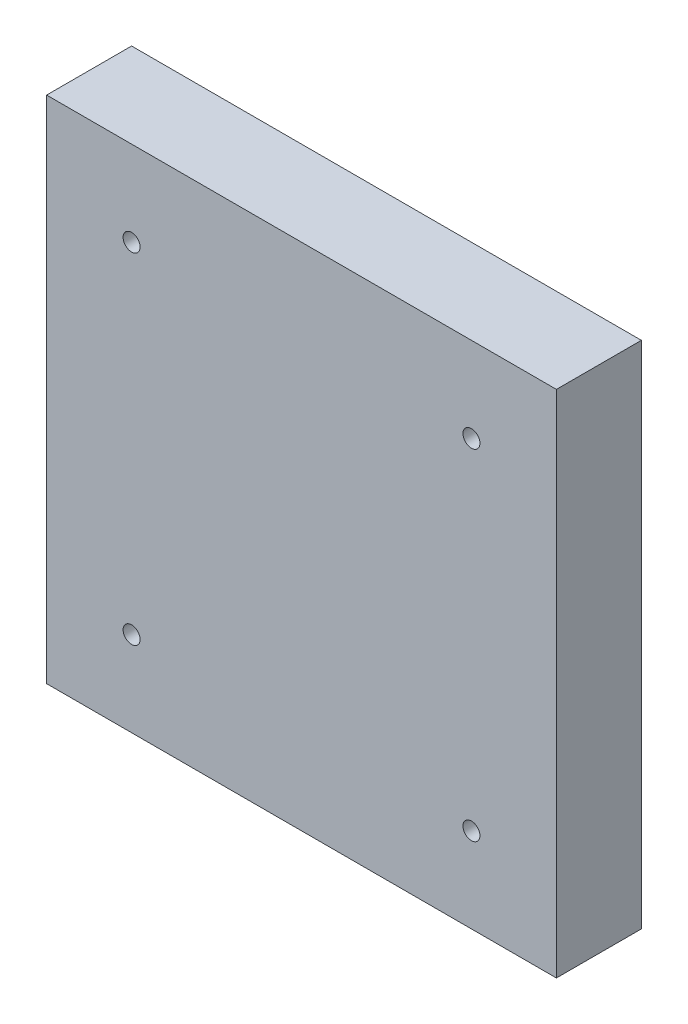
ISO-10303-21;
HEADER;
FILE_DESCRIPTION(('STEP AP214'),'2;1');
FILE_NAME('part.step','',(''),(''),'','','');
FILE_SCHEMA(('AUTOMOTIVE_DESIGN { 1 0 10303 214 1 1 1 1 }'));
ENDSEC;
DATA;
#1=APPLICATION_CONTEXT('core data for automotive mechanical design processes');
#2=APPLICATION_PROTOCOL_DEFINITION('international standard','automotive_design',2000,#1);
#3=PRODUCT_CONTEXT('',#1,'mechanical');
#4=PRODUCT('Part','Part','',(#3));
#5=PRODUCT_RELATED_PRODUCT_CATEGORY('part','',(#4));
#6=PRODUCT_DEFINITION_FORMATION('','',#4);
#7=PRODUCT_DEFINITION_CONTEXT('part definition',#1,'design');
#8=PRODUCT_DEFINITION('design','',#6,#7);
#9=PRODUCT_DEFINITION_SHAPE('','',#8);
#10=(LENGTH_UNIT() NAMED_UNIT(*) SI_UNIT(.MILLI.,.METRE.));
#11=(NAMED_UNIT(*) PLANE_ANGLE_UNIT() SI_UNIT($,.RADIAN.));
#12=(NAMED_UNIT(*) SI_UNIT($,.STERADIAN.) SOLID_ANGLE_UNIT());
#13=UNCERTAINTY_MEASURE_WITH_UNIT(LENGTH_MEASURE(1.E-05),#10,'distance_accuracy_value','');
#14=(GEOMETRIC_REPRESENTATION_CONTEXT(3) GLOBAL_UNCERTAINTY_ASSIGNED_CONTEXT((#13)) GLOBAL_UNIT_ASSIGNED_CONTEXT((#10,
#11,#12)) REPRESENTATION_CONTEXT('',''));
#15=CARTESIAN_POINT('',(0.,0.,0.));
#16=DIRECTION('',(0.,0.,1.));
#17=DIRECTION('',(1.,0.,0.));
#18=AXIS2_PLACEMENT_3D('',#15,#16,#17);
#19=CARTESIAN_POINT('',(0.,0.,12.7));
#20=DIRECTION('',(0.,0.,-1.));
#21=DIRECTION('',(-1.,0.,0.));
#22=AXIS2_PLACEMENT_3D('',#19,#20,#21);
#23=PLANE('',#22);
#24=CARTESIAN_POINT('',(63.5,63.5,12.7));
#25=DIRECTION('',(0.,0.,1.));
#26=DIRECTION('',(1.,0.,0.));
#27=AXIS2_PLACEMENT_3D('',#24,#25,#26);
#28=CIRCLE('',#27,1.26999999999999);
#29=CARTESIAN_POINT('',(64.77,63.5,12.7));
#30=VERTEX_POINT('',#29);
#31=EDGE_CURVE('E121',#30,#30,#28,.T.);
#32=ORIENTED_EDGE('',*,*,#31,.F.);
#33=EDGE_LOOP('',(#32));
#34=FACE_BOUND('',#33,.T.);
#35=CARTESIAN_POINT('',(12.7,12.7,12.7));
#36=DIRECTION('',(0.,0.,1.));
#37=DIRECTION('',(1.,0.,0.));
#38=AXIS2_PLACEMENT_3D('',#35,#36,#37);
#39=CIRCLE('',#38,1.27);
#40=CARTESIAN_POINT('',(13.97,12.7,12.7));
#41=VERTEX_POINT('',#40);
#42=EDGE_CURVE('E100',#41,#41,#39,.T.);
#43=ORIENTED_EDGE('',*,*,#42,.F.);
#44=EDGE_LOOP('',(#43));
#45=FACE_BOUND('',#44,.T.);
#46=DIRECTION('',(1.,0.,0.));
#47=VECTOR('',#46,1.);
#48=CARTESIAN_POINT('',(76.2,0.,12.7));
#49=LINE('',#48,#47);
#50=CARTESIAN_POINT('',(0.,0.,12.7));
#51=VERTEX_POINT('',#50);
#52=CARTESIAN_POINT('',(76.2,0.,12.7));
#53=VERTEX_POINT('',#52);
#54=EDGE_CURVE('E85',#51,#53,#49,.T.);
#55=ORIENTED_EDGE('',*,*,#54,.T.);
#56=DIRECTION('',(0.,1.,0.));
#57=VECTOR('',#56,1.);
#58=CARTESIAN_POINT('',(76.2,76.2,12.7));
#59=LINE('',#58,#57);
#60=CARTESIAN_POINT('',(76.2,76.2,12.7));
#61=VERTEX_POINT('',#60);
#62=EDGE_CURVE('E80',#53,#61,#59,.T.);
#63=ORIENTED_EDGE('',*,*,#62,.T.);
#64=DIRECTION('',(-1.,0.,0.));
#65=VECTOR('',#64,1.);
#66=CARTESIAN_POINT('',(0.,76.2,12.7));
#67=LINE('',#66,#65);
#68=CARTESIAN_POINT('',(0.,76.2,12.7));
#69=VERTEX_POINT('',#68);
#70=EDGE_CURVE('E83',#61,#69,#67,.T.);
#71=ORIENTED_EDGE('',*,*,#70,.T.);
#72=DIRECTION('',(0.,-1.,0.));
#73=VECTOR('',#72,1.);
#74=CARTESIAN_POINT('',(0.,0.,12.7));
#75=LINE('',#74,#73);
#76=EDGE_CURVE('E50',#69,#51,#75,.T.);
#77=ORIENTED_EDGE('',*,*,#76,.T.);
#78=EDGE_LOOP('',(#55,#63,#71,#77));
#79=FACE_BOUND('',#78,.T.);
#80=CARTESIAN_POINT('',(12.7,63.5,12.7));
#81=DIRECTION('',(0.,0.,1.));
#82=DIRECTION('',(1.,0.,0.));
#83=AXIS2_PLACEMENT_3D('',#80,#81,#82);
#84=CIRCLE('',#83,1.27);
#85=CARTESIAN_POINT('',(13.97,63.5,12.7));
#86=VERTEX_POINT('',#85);
#87=EDGE_CURVE('E115',#86,#86,#84,.T.);
#88=ORIENTED_EDGE('',*,*,#87,.F.);
#89=EDGE_LOOP('',(#88));
#90=FACE_BOUND('',#89,.T.);
#91=CARTESIAN_POINT('',(63.5,12.7,12.7));
#92=DIRECTION('',(0.,0.,1.));
#93=DIRECTION('',(1.,0.,0.));
#94=AXIS2_PLACEMENT_3D('',#91,#92,#93);
#95=CIRCLE('',#94,1.26999999999999);
#96=CARTESIAN_POINT('',(64.77,12.7,12.7));
#97=VERTEX_POINT('',#96);
#98=EDGE_CURVE('E127',#97,#97,#95,.T.);
#99=ORIENTED_EDGE('',*,*,#98,.F.);
#100=EDGE_LOOP('',(#99));
#101=FACE_BOUND('',#100,.T.);
#102=ADVANCED_FACE('F33',(#34,#45,#79,#90,#101),#23,.F.);
#103=CARTESIAN_POINT('',(0.,0.,0.));
#104=DIRECTION('',(0.,0.,-1.));
#105=DIRECTION('',(-1.,0.,0.));
#106=AXIS2_PLACEMENT_3D('',#103,#104,#105);
#107=PLANE('',#106);
#108=CARTESIAN_POINT('',(63.5,63.5,0.));
#109=DIRECTION('',(0.,0.,1.));
#110=DIRECTION('',(1.,0.,0.));
#111=AXIS2_PLACEMENT_3D('',#108,#109,#110);
#112=CIRCLE('',#111,1.26999999999999);
#113=CARTESIAN_POINT('',(64.77,63.5,0.));
#114=VERTEX_POINT('',#113);
#115=EDGE_CURVE('E124',#114,#114,#112,.T.);
#116=ORIENTED_EDGE('',*,*,#115,.T.);
#117=EDGE_LOOP('',(#116));
#118=FACE_BOUND('',#117,.T.);
#119=CARTESIAN_POINT('',(12.7,12.7,0.));
#120=DIRECTION('',(0.,0.,1.));
#121=DIRECTION('',(1.,0.,0.));
#122=AXIS2_PLACEMENT_3D('',#119,#120,#121);
#123=CIRCLE('',#122,1.27);
#124=CARTESIAN_POINT('',(13.97,12.7,0.));
#125=VERTEX_POINT('',#124);
#126=EDGE_CURVE('E112',#125,#125,#123,.T.);
#127=ORIENTED_EDGE('',*,*,#126,.T.);
#128=EDGE_LOOP('',(#127));
#129=FACE_BOUND('',#128,.T.);
#130=DIRECTION('',(1.,0.,0.));
#131=VECTOR('',#130,1.);
#132=CARTESIAN_POINT('',(76.2,0.,0.));
#133=LINE('',#132,#131);
#134=CARTESIAN_POINT('',(0.,0.,0.));
#135=VERTEX_POINT('',#134);
#136=CARTESIAN_POINT('',(76.2,0.,0.));
#137=VERTEX_POINT('',#136);
#138=EDGE_CURVE('E97',#135,#137,#133,.T.);
#139=ORIENTED_EDGE('',*,*,#138,.F.);
#140=DIRECTION('',(0.,-1.,0.));
#141=VECTOR('',#140,1.);
#142=CARTESIAN_POINT('',(0.,0.,0.));
#143=LINE('',#142,#141);
#144=CARTESIAN_POINT('',(0.,76.2,0.));
#145=VERTEX_POINT('',#144);
#146=EDGE_CURVE('E73',#145,#135,#143,.T.);
#147=ORIENTED_EDGE('',*,*,#146,.F.);
#148=DIRECTION('',(-1.,0.,0.));
#149=VECTOR('',#148,1.);
#150=CARTESIAN_POINT('',(0.,76.2,0.));
#151=LINE('',#150,#149);
#152=CARTESIAN_POINT('',(76.2,76.2,0.));
#153=VERTEX_POINT('',#152);
#154=EDGE_CURVE('E67',#153,#145,#151,.T.);
#155=ORIENTED_EDGE('',*,*,#154,.F.);
#156=DIRECTION('',(0.,1.,0.));
#157=VECTOR('',#156,1.);
#158=CARTESIAN_POINT('',(76.2,76.2,0.));
#159=LINE('',#158,#157);
#160=EDGE_CURVE('E89',#137,#153,#159,.T.);
#161=ORIENTED_EDGE('',*,*,#160,.F.);
#162=EDGE_LOOP('',(#139,#147,#155,#161));
#163=FACE_BOUND('',#162,.T.);
#164=CARTESIAN_POINT('',(12.7,63.5,0.));
#165=DIRECTION('',(0.,0.,1.));
#166=DIRECTION('',(1.,0.,0.));
#167=AXIS2_PLACEMENT_3D('',#164,#165,#166);
#168=CIRCLE('',#167,1.27);
#169=CARTESIAN_POINT('',(13.97,63.5,0.));
#170=VERTEX_POINT('',#169);
#171=EDGE_CURVE('E118',#170,#170,#168,.T.);
#172=ORIENTED_EDGE('',*,*,#171,.T.);
#173=EDGE_LOOP('',(#172));
#174=FACE_BOUND('',#173,.T.);
#175=CARTESIAN_POINT('',(63.5,12.7,0.));
#176=DIRECTION('',(0.,0.,1.));
#177=DIRECTION('',(1.,0.,0.));
#178=AXIS2_PLACEMENT_3D('',#175,#176,#177);
#179=CIRCLE('',#178,1.26999999999999);
#180=CARTESIAN_POINT('',(64.77,12.7,0.));
#181=VERTEX_POINT('',#180);
#182=EDGE_CURVE('E130',#181,#181,#179,.T.);
#183=ORIENTED_EDGE('',*,*,#182,.T.);
#184=EDGE_LOOP('',(#183));
#185=FACE_BOUND('',#184,.T.);
#186=ADVANCED_FACE('F108',(#118,#129,#163,#174,#185),#107,.T.);
#187=CARTESIAN_POINT('',(76.2,0.,12.7));
#188=DIRECTION('',(0.,1.,0.));
#189=DIRECTION('',(-1.,0.,0.));
#190=AXIS2_PLACEMENT_3D('',#187,#188,#189);
#191=PLANE('',#190);
#192=ORIENTED_EDGE('',*,*,#138,.T.);
#193=DIRECTION('',(0.,0.,-1.));
#194=VECTOR('',#193,1.);
#195=CARTESIAN_POINT('',(76.2,0.,12.7));
#196=LINE('',#195,#194);
#197=EDGE_CURVE('E11',#53,#137,#196,.T.);
#198=ORIENTED_EDGE('',*,*,#197,.F.);
#199=ORIENTED_EDGE('',*,*,#54,.F.);
#200=DIRECTION('',(0.,0.,-1.));
#201=VECTOR('',#200,1.);
#202=CARTESIAN_POINT('',(0.,0.,12.7));
#203=LINE('',#202,#201);
#204=EDGE_CURVE('E93',#51,#135,#203,.T.);
#205=ORIENTED_EDGE('',*,*,#204,.T.);
#206=EDGE_LOOP('',(#192,#198,#199,#205));
#207=FACE_BOUND('',#206,.T.);
#208=ADVANCED_FACE('F35',(#207),#191,.F.);
#209=CARTESIAN_POINT('',(76.2,76.2,12.7));
#210=DIRECTION('',(-1.,0.,0.));
#211=DIRECTION('',(0.,-1.,0.));
#212=AXIS2_PLACEMENT_3D('',#209,#210,#211);
#213=PLANE('',#212);
#214=ORIENTED_EDGE('',*,*,#160,.T.);
#215=DIRECTION('',(0.,0.,-1.));
#216=VECTOR('',#215,1.);
#217=CARTESIAN_POINT('',(76.2,76.2,12.7));
#218=LINE('',#217,#216);
#219=EDGE_CURVE('E42',#61,#153,#218,.T.);
#220=ORIENTED_EDGE('',*,*,#219,.F.);
#221=ORIENTED_EDGE('',*,*,#62,.F.);
#222=ORIENTED_EDGE('',*,*,#197,.T.);
#223=EDGE_LOOP('',(#214,#220,#221,#222));
#224=FACE_BOUND('',#223,.T.);
#225=ADVANCED_FACE('F88',(#224),#213,.F.);
#226=CARTESIAN_POINT('',(0.,76.2,12.7));
#227=DIRECTION('',(0.,-1.,0.));
#228=DIRECTION('',(0.,0.,-1.));
#229=AXIS2_PLACEMENT_3D('',#226,#227,#228);
#230=PLANE('',#229);
#231=ORIENTED_EDGE('',*,*,#154,.T.);
#232=DIRECTION('',(0.,0.,-1.));
#233=VECTOR('',#232,1.);
#234=CARTESIAN_POINT('',(0.,76.2,12.7));
#235=LINE('',#234,#233);
#236=EDGE_CURVE('E90',#69,#145,#235,.T.);
#237=ORIENTED_EDGE('',*,*,#236,.F.);
#238=ORIENTED_EDGE('',*,*,#70,.F.);
#239=ORIENTED_EDGE('',*,*,#219,.T.);
#240=EDGE_LOOP('',(#231,#237,#238,#239));
#241=FACE_BOUND('',#240,.T.);
#242=ADVANCED_FACE('F91',(#241),#230,.F.);
#243=CARTESIAN_POINT('',(0.,0.,12.7));
#244=DIRECTION('',(1.,0.,0.));
#245=DIRECTION('',(0.,0.,-1.));
#246=AXIS2_PLACEMENT_3D('',#243,#244,#245);
#247=PLANE('',#246);
#248=ORIENTED_EDGE('',*,*,#146,.T.);
#249=ORIENTED_EDGE('',*,*,#204,.F.);
#250=ORIENTED_EDGE('',*,*,#76,.F.);
#251=ORIENTED_EDGE('',*,*,#236,.T.);
#252=EDGE_LOOP('',(#248,#249,#250,#251));
#253=FACE_BOUND('',#252,.T.);
#254=ADVANCED_FACE('F105',(#253),#247,.F.);
#255=CARTESIAN_POINT('',(12.7,12.7,12.7));
#256=DIRECTION('',(0.,0.,-1.));
#257=DIRECTION('',(-1.,0.,0.));
#258=AXIS2_PLACEMENT_3D('',#255,#256,#257);
#259=CYLINDRICAL_SURFACE('',#258,1.27);
#260=ORIENTED_EDGE('',*,*,#42,.T.);
#261=EDGE_LOOP('',(#260));
#262=FACE_BOUND('',#261,.T.);
#263=ORIENTED_EDGE('',*,*,#126,.F.);
#264=EDGE_LOOP('',(#263));
#265=FACE_BOUND('',#264,.T.);
#266=ADVANCED_FACE('F150',(#262,#265),#259,.F.);
#267=CARTESIAN_POINT('',(12.7,63.5,12.7));
#268=DIRECTION('',(0.,0.,-1.));
#269=DIRECTION('',(-1.,0.,0.));
#270=AXIS2_PLACEMENT_3D('',#267,#268,#269);
#271=CYLINDRICAL_SURFACE('',#270,1.27);
#272=ORIENTED_EDGE('',*,*,#87,.T.);
#273=EDGE_LOOP('',(#272));
#274=FACE_BOUND('',#273,.T.);
#275=ORIENTED_EDGE('',*,*,#171,.F.);
#276=EDGE_LOOP('',(#275));
#277=FACE_BOUND('',#276,.T.);
#278=ADVANCED_FACE('F196',(#274,#277),#271,.F.);
#279=CARTESIAN_POINT('',(63.5,63.5,12.7));
#280=DIRECTION('',(0.,0.,-1.));
#281=DIRECTION('',(-1.,0.,0.));
#282=AXIS2_PLACEMENT_3D('',#279,#280,#281);
#283=CYLINDRICAL_SURFACE('',#282,1.26999999999999);
#284=ORIENTED_EDGE('',*,*,#31,.T.);
#285=EDGE_LOOP('',(#284));
#286=FACE_BOUND('',#285,.T.);
#287=ORIENTED_EDGE('',*,*,#115,.F.);
#288=EDGE_LOOP('',(#287));
#289=FACE_BOUND('',#288,.T.);
#290=ADVANCED_FACE('F204',(#286,#289),#283,.F.);
#291=CARTESIAN_POINT('',(63.5,12.7,12.7));
#292=DIRECTION('',(0.,0.,-1.));
#293=DIRECTION('',(-1.,0.,0.));
#294=AXIS2_PLACEMENT_3D('',#291,#292,#293);
#295=CYLINDRICAL_SURFACE('',#294,1.26999999999999);
#296=ORIENTED_EDGE('',*,*,#98,.T.);
#297=EDGE_LOOP('',(#296));
#298=FACE_BOUND('',#297,.T.);
#299=ORIENTED_EDGE('',*,*,#182,.F.);
#300=EDGE_LOOP('',(#299));
#301=FACE_BOUND('',#300,.T.);
#302=ADVANCED_FACE('F136',(#298,#301),#295,.F.);
#303=CLOSED_SHELL('',(#102,#186,#208,#225,#242,#254,#266,#278,#290,#302));
#304=MANIFOLD_SOLID_BREP('B2',#303);
#305=ADVANCED_BREP_SHAPE_REPRESENTATION('',(#18,#304),#14);
#306=SHAPE_DEFINITION_REPRESENTATION(#9,#305);
ENDSEC;
END-ISO-10303-21;
